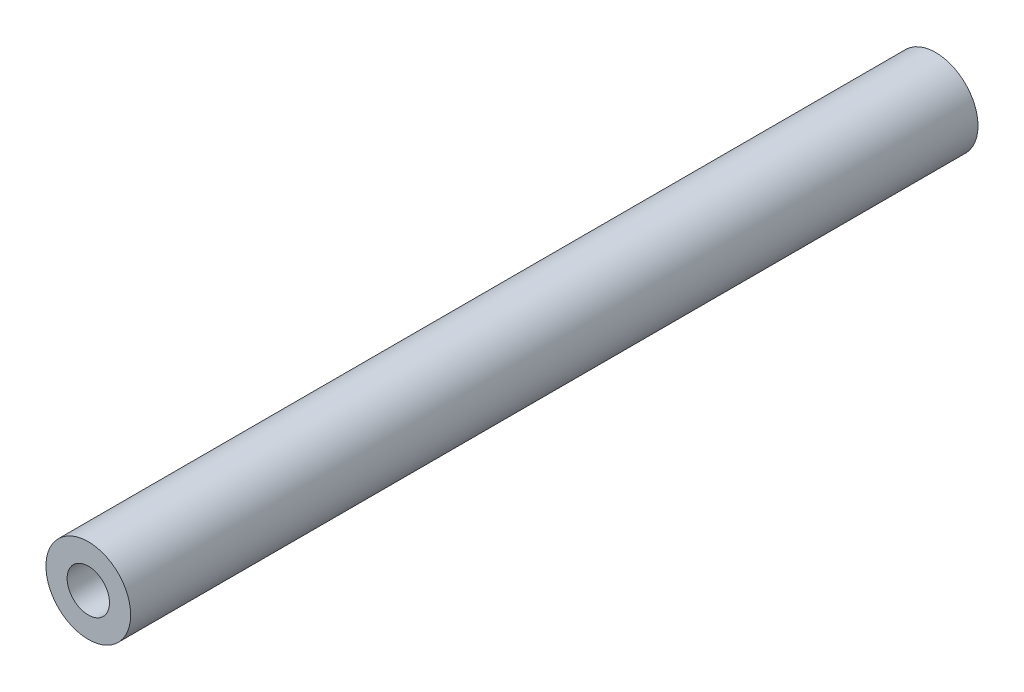
ISO-10303-21;
HEADER;
FILE_DESCRIPTION(('STEP AP214'),'2;1');
FILE_NAME('part.step','',(''),(''),'','','');
FILE_SCHEMA(('AUTOMOTIVE_DESIGN { 1 0 10303 214 1 1 1 1 }'));
ENDSEC;
DATA;
#1=APPLICATION_CONTEXT('core data for automotive mechanical design processes');
#2=APPLICATION_PROTOCOL_DEFINITION('international standard','automotive_design',2000,#1);
#3=PRODUCT_CONTEXT('',#1,'mechanical');
#4=PRODUCT('Part','Part','',(#3));
#5=PRODUCT_RELATED_PRODUCT_CATEGORY('part','',(#4));
#6=PRODUCT_DEFINITION_FORMATION('','',#4);
#7=PRODUCT_DEFINITION_CONTEXT('part definition',#1,'design');
#8=PRODUCT_DEFINITION('design','',#6,#7);
#9=PRODUCT_DEFINITION_SHAPE('','',#8);
#10=(LENGTH_UNIT() NAMED_UNIT(*) SI_UNIT(.MILLI.,.METRE.));
#11=(NAMED_UNIT(*) PLANE_ANGLE_UNIT() SI_UNIT($,.RADIAN.));
#12=(NAMED_UNIT(*) SI_UNIT($,.STERADIAN.) SOLID_ANGLE_UNIT());
#13=UNCERTAINTY_MEASURE_WITH_UNIT(LENGTH_MEASURE(1.E-05),#10,'distance_accuracy_value','');
#14=(GEOMETRIC_REPRESENTATION_CONTEXT(3) GLOBAL_UNCERTAINTY_ASSIGNED_CONTEXT((#13)) GLOBAL_UNIT_ASSIGNED_CONTEXT((#10,
#11,#12)) REPRESENTATION_CONTEXT('',''));
#15=CARTESIAN_POINT('',(0.,0.,0.));
#16=DIRECTION('',(0.,0.,1.));
#17=DIRECTION('',(1.,0.,0.));
#18=AXIS2_PLACEMENT_3D('',#15,#16,#17);
#19=CARTESIAN_POINT('',(0.,0.,100.));
#20=DIRECTION('',(0.,0.,1.));
#21=DIRECTION('',(1.,0.,0.));
#22=AXIS2_PLACEMENT_3D('',#19,#20,#21);
#23=PLANE('',#22);
#24=CARTESIAN_POINT('',(0.,0.,100.));
#25=DIRECTION('',(0.,0.,1.));
#26=DIRECTION('',(1.,0.,0.));
#27=AXIS2_PLACEMENT_3D('',#24,#25,#26);
#28=CIRCLE('',#27,5.);
#29=CARTESIAN_POINT('',(5.,0.,100.));
#30=VERTEX_POINT('',#29);
#31=EDGE_CURVE('E10',#30,#30,#28,.T.);
#32=ORIENTED_EDGE('',*,*,#31,.T.);
#33=EDGE_LOOP('',(#32));
#34=FACE_BOUND('',#33,.T.);
#35=CARTESIAN_POINT('',(0.,0.,100.));
#36=DIRECTION('',(0.,0.,1.));
#37=DIRECTION('',(1.,0.,0.));
#38=AXIS2_PLACEMENT_3D('',#35,#36,#37);
#39=CIRCLE('',#38,2.5);
#40=CARTESIAN_POINT('',(2.5,0.,100.));
#41=VERTEX_POINT('',#40);
#42=EDGE_CURVE('E57',#41,#41,#39,.T.);
#43=ORIENTED_EDGE('',*,*,#42,.F.);
#44=EDGE_LOOP('',(#43));
#45=FACE_BOUND('',#44,.T.);
#46=ADVANCED_FACE('F43',(#34,#45),#23,.T.);
#47=CARTESIAN_POINT('',(0.,0.,0.));
#48=DIRECTION('',(0.,0.,1.));
#49=DIRECTION('',(1.,0.,0.));
#50=AXIS2_PLACEMENT_3D('',#47,#48,#49);
#51=PLANE('',#50);
#52=CARTESIAN_POINT('',(0.,0.,0.));
#53=DIRECTION('',(0.,0.,1.));
#54=DIRECTION('',(1.,0.,0.));
#55=AXIS2_PLACEMENT_3D('',#52,#53,#54);
#56=CIRCLE('',#55,5.);
#57=CARTESIAN_POINT('',(5.,0.,0.));
#58=VERTEX_POINT('',#57);
#59=EDGE_CURVE('E50',#58,#58,#56,.T.);
#60=ORIENTED_EDGE('',*,*,#59,.F.);
#61=EDGE_LOOP('',(#60));
#62=FACE_BOUND('',#61,.T.);
#63=CARTESIAN_POINT('',(0.,0.,0.));
#64=DIRECTION('',(0.,0.,1.));
#65=DIRECTION('',(1.,0.,0.));
#66=AXIS2_PLACEMENT_3D('',#63,#64,#65);
#67=CIRCLE('',#66,2.5);
#68=CARTESIAN_POINT('',(2.5,0.,0.));
#69=VERTEX_POINT('',#68);
#70=EDGE_CURVE('E59',#69,#69,#67,.T.);
#71=ORIENTED_EDGE('',*,*,#70,.T.);
#72=EDGE_LOOP('',(#71));
#73=FACE_BOUND('',#72,.T.);
#74=ADVANCED_FACE('F68',(#62,#73),#51,.F.);
#75=CARTESIAN_POINT('',(0.,0.,100.));
#76=DIRECTION('',(0.,0.,-1.));
#77=DIRECTION('',(-1.,0.,0.));
#78=AXIS2_PLACEMENT_3D('',#75,#76,#77);
#79=CYLINDRICAL_SURFACE('',#78,5.);
#80=ORIENTED_EDGE('',*,*,#31,.F.);
#81=EDGE_LOOP('',(#80));
#82=FACE_BOUND('',#81,.T.);
#83=ORIENTED_EDGE('',*,*,#59,.T.);
#84=EDGE_LOOP('',(#83));
#85=FACE_BOUND('',#84,.T.);
#86=ADVANCED_FACE('F44',(#82,#85),#79,.T.);
#87=CARTESIAN_POINT('',(0.,0.,100.));
#88=DIRECTION('',(0.,0.,-1.));
#89=DIRECTION('',(-1.,0.,0.));
#90=AXIS2_PLACEMENT_3D('',#87,#88,#89);
#91=CYLINDRICAL_SURFACE('',#90,2.5);
#92=ORIENTED_EDGE('',*,*,#42,.T.);
#93=EDGE_LOOP('',(#92));
#94=FACE_BOUND('',#93,.T.);
#95=ORIENTED_EDGE('',*,*,#70,.F.);
#96=EDGE_LOOP('',(#95));
#97=FACE_BOUND('',#96,.T.);
#98=ADVANCED_FACE('F67',(#94,#97),#91,.F.);
#99=CLOSED_SHELL('',(#46,#74,#86,#98));
#100=MANIFOLD_SOLID_BREP('B2',#99);
#101=ADVANCED_BREP_SHAPE_REPRESENTATION('',(#18,#100),#14);
#102=SHAPE_DEFINITION_REPRESENTATION(#9,#101);
ENDSEC;
END-ISO-10303-21;
